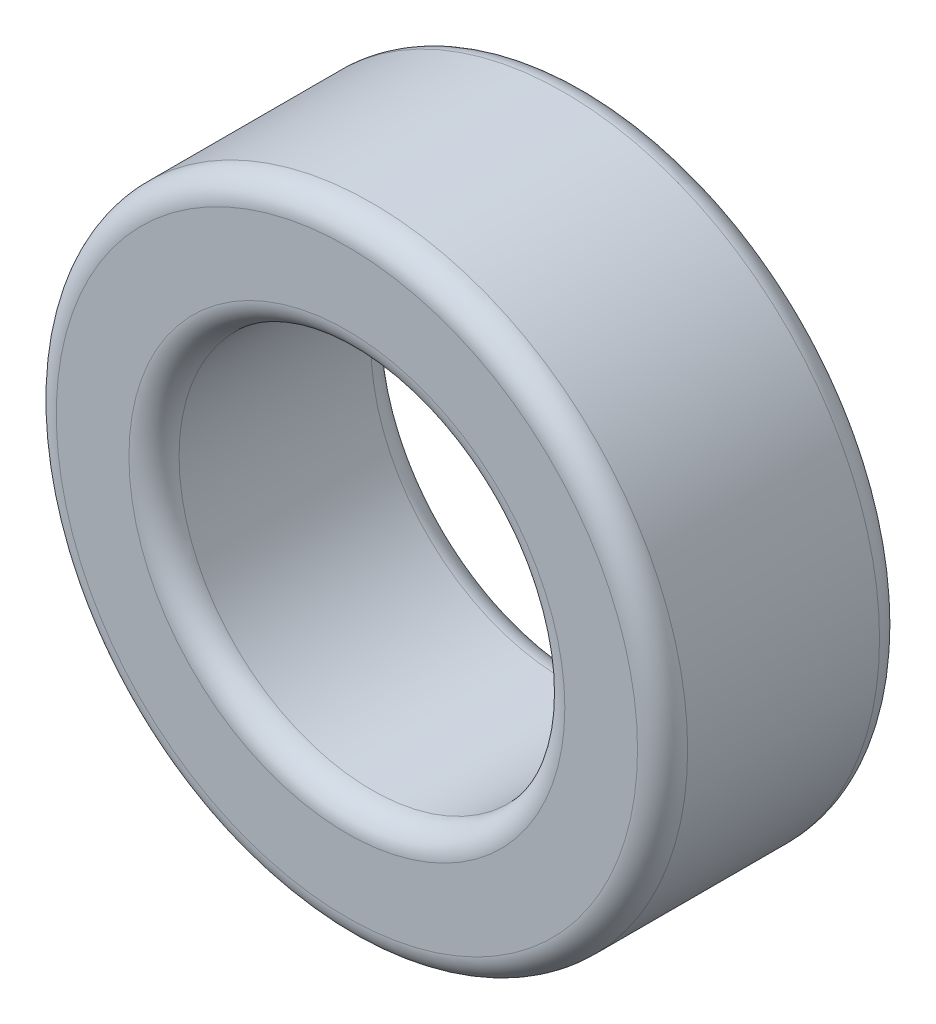
ISO-10303-21;
HEADER;
FILE_DESCRIPTION(('STEP AP214'),'2;1');
FILE_NAME('part.step','',(''),(''),'','','');
FILE_SCHEMA(('AUTOMOTIVE_DESIGN { 1 0 10303 214 1 1 1 1 }'));
ENDSEC;
DATA;
#1=APPLICATION_CONTEXT('core data for automotive mechanical design processes');
#2=APPLICATION_PROTOCOL_DEFINITION('international standard','automotive_design',2000,#1);
#3=PRODUCT_CONTEXT('',#1,'mechanical');
#4=PRODUCT('Part','Part','',(#3));
#5=PRODUCT_RELATED_PRODUCT_CATEGORY('part','',(#4));
#6=PRODUCT_DEFINITION_FORMATION('','',#4);
#7=PRODUCT_DEFINITION_CONTEXT('part definition',#1,'design');
#8=PRODUCT_DEFINITION('design','',#6,#7);
#9=PRODUCT_DEFINITION_SHAPE('','',#8);
#10=(LENGTH_UNIT() NAMED_UNIT(*) SI_UNIT(.MILLI.,.METRE.));
#11=(NAMED_UNIT(*) PLANE_ANGLE_UNIT() SI_UNIT($,.RADIAN.));
#12=(NAMED_UNIT(*) SI_UNIT($,.STERADIAN.) SOLID_ANGLE_UNIT());
#13=UNCERTAINTY_MEASURE_WITH_UNIT(LENGTH_MEASURE(1.E-05),#10,'distance_accuracy_value','');
#14=(GEOMETRIC_REPRESENTATION_CONTEXT(3) GLOBAL_UNCERTAINTY_ASSIGNED_CONTEXT((#13)) GLOBAL_UNIT_ASSIGNED_CONTEXT((#10,
#11,#12)) REPRESENTATION_CONTEXT('',''));
#15=CARTESIAN_POINT('',(0.,0.,0.));
#16=DIRECTION('',(0.,0.,1.));
#17=DIRECTION('',(1.,0.,0.));
#18=AXIS2_PLACEMENT_3D('',#15,#16,#17);
#19=CARTESIAN_POINT('',(0.,0.,4.83));
#20=DIRECTION('',(0.,0.,1.));
#21=DIRECTION('',(1.,0.,0.));
#22=AXIS2_PLACEMENT_3D('',#19,#20,#21);
#23=PLANE('',#22);
#24=CARTESIAN_POINT('',(0.,0.,4.83));
#25=DIRECTION('',(0.,0.,1.));
#26=DIRECTION('',(1.,0.,0.));
#27=AXIS2_PLACEMENT_3D('',#24,#25,#26);
#28=CIRCLE('',#27,4.35);
#29=CARTESIAN_POINT('',(4.35,0.,4.83));
#30=VERTEX_POINT('',#29);
#31=EDGE_CURVE('E57',#30,#30,#28,.F.);
#32=ORIENTED_EDGE('',*,*,#31,.T.);
#33=EDGE_LOOP('',(#32));
#34=FACE_BOUND('',#33,.T.);
#35=CARTESIAN_POINT('',(0.,0.,4.83));
#36=DIRECTION('',(0.,0.,1.));
#37=DIRECTION('',(1.,0.,0.));
#38=AXIS2_PLACEMENT_3D('',#35,#36,#37);
#39=CIRCLE('',#38,5.8);
#40=CARTESIAN_POINT('',(5.8,0.,4.83));
#41=VERTEX_POINT('',#40);
#42=EDGE_CURVE('E60',#41,#41,#39,.T.);
#43=ORIENTED_EDGE('',*,*,#42,.T.);
#44=EDGE_LOOP('',(#43));
#45=FACE_BOUND('',#44,.T.);
#46=ADVANCED_FACE('F37',(#34,#45),#23,.T.);
#47=CARTESIAN_POINT('',(0.,0.,0.));
#48=DIRECTION('',(0.,0.,1.));
#49=DIRECTION('',(1.,0.,0.));
#50=AXIS2_PLACEMENT_3D('',#47,#48,#49);
#51=PLANE('',#50);
#52=CARTESIAN_POINT('',(0.,0.,0.));
#53=DIRECTION('',(0.,0.,1.));
#54=DIRECTION('',(1.,0.,0.));
#55=AXIS2_PLACEMENT_3D('',#52,#53,#54);
#56=CIRCLE('',#55,5.8);
#57=CARTESIAN_POINT('',(5.8,0.,0.));
#58=VERTEX_POINT('',#57);
#59=EDGE_CURVE('E10',#58,#58,#56,.F.);
#60=ORIENTED_EDGE('',*,*,#59,.T.);
#61=EDGE_LOOP('',(#60));
#62=FACE_BOUND('',#61,.T.);
#63=CARTESIAN_POINT('',(0.,0.,0.));
#64=DIRECTION('',(0.,0.,1.));
#65=DIRECTION('',(1.,0.,0.));
#66=AXIS2_PLACEMENT_3D('',#63,#64,#65);
#67=CIRCLE('',#66,4.35);
#68=CARTESIAN_POINT('',(4.35,0.,0.));
#69=VERTEX_POINT('',#68);
#70=EDGE_CURVE('E44',#69,#69,#67,.T.);
#71=ORIENTED_EDGE('',*,*,#70,.T.);
#72=EDGE_LOOP('',(#71));
#73=FACE_BOUND('',#72,.T.);
#74=ADVANCED_FACE('F81',(#62,#73),#51,.F.);
#75=CARTESIAN_POINT('',(0.,0.,4.83));
#76=DIRECTION('',(0.,0.,-1.));
#77=DIRECTION('',(-1.,0.,0.));
#78=AXIS2_PLACEMENT_3D('',#75,#76,#77);
#79=CYLINDRICAL_SURFACE('',#78,6.3);
#80=CARTESIAN_POINT('',(0.,0.,4.33));
#81=DIRECTION('',(0.,0.,1.));
#82=DIRECTION('',(1.,0.,0.));
#83=AXIS2_PLACEMENT_3D('',#80,#81,#82);
#84=CIRCLE('',#83,6.3);
#85=CARTESIAN_POINT('',(6.3,0.,4.33));
#86=VERTEX_POINT('',#85);
#87=EDGE_CURVE('E48',#86,#86,#84,.F.);
#88=ORIENTED_EDGE('',*,*,#87,.T.);
#89=EDGE_LOOP('',(#88));
#90=FACE_BOUND('',#89,.T.);
#91=CARTESIAN_POINT('',(0.,0.,0.5));
#92=DIRECTION('',(0.,0.,1.));
#93=DIRECTION('',(1.,0.,0.));
#94=AXIS2_PLACEMENT_3D('',#91,#92,#93);
#95=CIRCLE('',#94,6.3);
#96=CARTESIAN_POINT('',(6.3,0.,0.5));
#97=VERTEX_POINT('',#96);
#98=EDGE_CURVE('E52',#97,#97,#95,.T.);
#99=ORIENTED_EDGE('',*,*,#98,.T.);
#100=EDGE_LOOP('',(#99));
#101=FACE_BOUND('',#100,.T.);
#102=ADVANCED_FACE('F87',(#90,#101),#79,.T.);
#103=CARTESIAN_POINT('',(0.,0.,4.83));
#104=DIRECTION('',(0.,0.,-1.));
#105=DIRECTION('',(-1.,0.,0.));
#106=AXIS2_PLACEMENT_3D('',#103,#104,#105);
#107=CYLINDRICAL_SURFACE('',#106,3.85);
#108=CARTESIAN_POINT('',(0.,0.,4.33));
#109=DIRECTION('',(0.,0.,1.));
#110=DIRECTION('',(1.,0.,0.));
#111=AXIS2_PLACEMENT_3D('',#108,#109,#110);
#112=CIRCLE('',#111,3.85);
#113=CARTESIAN_POINT('',(3.85,0.,4.33));
#114=VERTEX_POINT('',#113);
#115=EDGE_CURVE('E63',#114,#114,#112,.T.);
#116=ORIENTED_EDGE('',*,*,#115,.T.);
#117=EDGE_LOOP('',(#116));
#118=FACE_BOUND('',#117,.T.);
#119=CARTESIAN_POINT('',(0.,0.,0.5));
#120=DIRECTION('',(0.,0.,1.));
#121=DIRECTION('',(1.,0.,0.));
#122=AXIS2_PLACEMENT_3D('',#119,#120,#121);
#123=CIRCLE('',#122,3.85);
#124=CARTESIAN_POINT('',(3.85,0.,0.5));
#125=VERTEX_POINT('',#124);
#126=EDGE_CURVE('E66',#125,#125,#123,.F.);
#127=ORIENTED_EDGE('',*,*,#126,.T.);
#128=EDGE_LOOP('',(#127));
#129=FACE_BOUND('',#128,.T.);
#130=ADVANCED_FACE('F70',(#118,#129),#107,.F.);
#131=CARTESIAN_POINT('',(0.,0.,4.33));
#132=DIRECTION('',(0.,0.,1.));
#133=DIRECTION('',(1.,0.,0.));
#134=AXIS2_PLACEMENT_3D('',#131,#132,#133);
#135=TOROIDAL_SURFACE('',#134,4.35,0.5);
#136=ORIENTED_EDGE('',*,*,#31,.F.);
#137=EDGE_LOOP('',(#136));
#138=FACE_BOUND('',#137,.T.);
#139=ORIENTED_EDGE('',*,*,#115,.F.);
#140=EDGE_LOOP('',(#139));
#141=FACE_BOUND('',#140,.T.);
#142=ADVANCED_FACE('F95',(#138,#141),#135,.T.);
#143=CARTESIAN_POINT('',(0.,0.,4.33));
#144=DIRECTION('',(0.,0.,1.));
#145=DIRECTION('',(1.,0.,0.));
#146=AXIS2_PLACEMENT_3D('',#143,#144,#145);
#147=TOROIDAL_SURFACE('',#146,5.8,0.5);
#148=ORIENTED_EDGE('',*,*,#87,.F.);
#149=EDGE_LOOP('',(#148));
#150=FACE_BOUND('',#149,.T.);
#151=ORIENTED_EDGE('',*,*,#42,.F.);
#152=EDGE_LOOP('',(#151));
#153=FACE_BOUND('',#152,.T.);
#154=ADVANCED_FACE('F78',(#150,#153),#147,.T.);
#155=CARTESIAN_POINT('',(0.,0.,0.5));
#156=DIRECTION('',(0.,0.,1.));
#157=DIRECTION('',(1.,0.,0.));
#158=AXIS2_PLACEMENT_3D('',#155,#156,#157);
#159=TOROIDAL_SURFACE('',#158,5.8,0.5);
#160=ORIENTED_EDGE('',*,*,#59,.F.);
#161=EDGE_LOOP('',(#160));
#162=FACE_BOUND('',#161,.T.);
#163=ORIENTED_EDGE('',*,*,#98,.F.);
#164=EDGE_LOOP('',(#163));
#165=FACE_BOUND('',#164,.T.);
#166=ADVANCED_FACE('F74',(#162,#165),#159,.T.);
#167=CARTESIAN_POINT('',(0.,0.,0.5));
#168=DIRECTION('',(0.,0.,1.));
#169=DIRECTION('',(1.,0.,0.));
#170=AXIS2_PLACEMENT_3D('',#167,#168,#169);
#171=TOROIDAL_SURFACE('',#170,4.35,0.5);
#172=ORIENTED_EDGE('',*,*,#126,.F.);
#173=EDGE_LOOP('',(#172));
#174=FACE_BOUND('',#173,.T.);
#175=ORIENTED_EDGE('',*,*,#70,.F.);
#176=EDGE_LOOP('',(#175));
#177=FACE_BOUND('',#176,.T.);
#178=ADVANCED_FACE('F39',(#174,#177),#171,.T.);
#179=CLOSED_SHELL('',(#46,#74,#102,#130,#142,#154,#166,#178));
#180=MANIFOLD_SOLID_BREP('B2',#179);
#181=ADVANCED_BREP_SHAPE_REPRESENTATION('',(#18,#180),#14);
#182=SHAPE_DEFINITION_REPRESENTATION(#9,#181);
ENDSEC;
END-ISO-10303-21;
